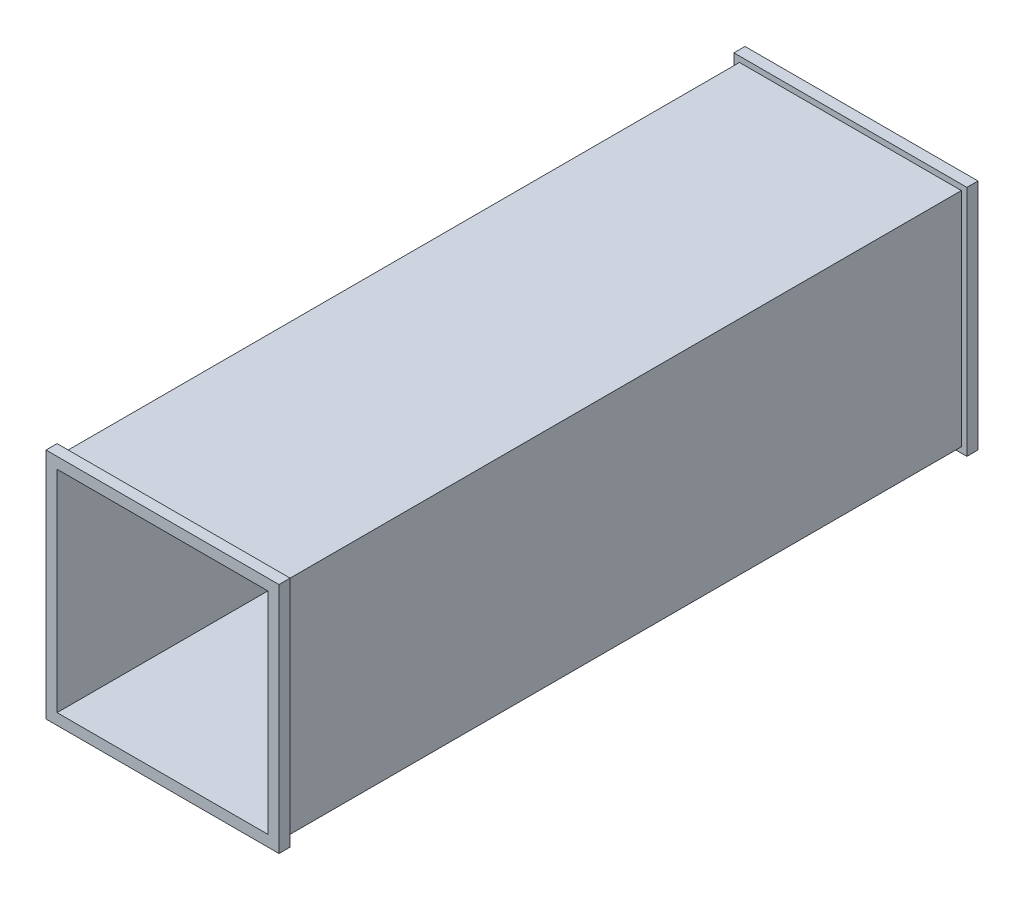
ISO-10303-21;
HEADER;
FILE_DESCRIPTION(('STEP AP214'),'2;1');
FILE_NAME('part.step','',(''),(''),'','','');
FILE_SCHEMA(('AUTOMOTIVE_DESIGN { 1 0 10303 214 1 1 1 1 }'));
ENDSEC;
DATA;
#1=APPLICATION_CONTEXT('core data for automotive mechanical design processes');
#2=APPLICATION_PROTOCOL_DEFINITION('international standard','automotive_design',2000,#1);
#3=PRODUCT_CONTEXT('',#1,'mechanical');
#4=PRODUCT('Part','Part','',(#3));
#5=PRODUCT_RELATED_PRODUCT_CATEGORY('part','',(#4));
#6=PRODUCT_DEFINITION_FORMATION('','',#4);
#7=PRODUCT_DEFINITION_CONTEXT('part definition',#1,'design');
#8=PRODUCT_DEFINITION('design','',#6,#7);
#9=PRODUCT_DEFINITION_SHAPE('','',#8);
#10=(LENGTH_UNIT() NAMED_UNIT(*) SI_UNIT(.MILLI.,.METRE.));
#11=(NAMED_UNIT(*) PLANE_ANGLE_UNIT() SI_UNIT($,.RADIAN.));
#12=(NAMED_UNIT(*) SI_UNIT($,.STERADIAN.) SOLID_ANGLE_UNIT());
#13=UNCERTAINTY_MEASURE_WITH_UNIT(LENGTH_MEASURE(1.E-05),#10,'distance_accuracy_value','');
#14=(GEOMETRIC_REPRESENTATION_CONTEXT(3) GLOBAL_UNCERTAINTY_ASSIGNED_CONTEXT((#13)) GLOBAL_UNIT_ASSIGNED_CONTEXT((#10,
#11,#12)) REPRESENTATION_CONTEXT('',''));
#15=CARTESIAN_POINT('',(0.,0.,0.));
#16=DIRECTION('',(0.,0.,1.));
#17=DIRECTION('',(1.,0.,0.));
#18=AXIS2_PLACEMENT_3D('',#15,#16,#17);
#19=CARTESIAN_POINT('',(254.,0.,0.));
#20=DIRECTION('',(1.,0.,0.));
#21=DIRECTION('',(0.,0.,-1.));
#22=AXIS2_PLACEMENT_3D('',#19,#20,#21);
#23=PLANE('',#22);
#24=DIRECTION('',(0.,0.,-1.));
#25=VECTOR('',#24,1.);
#26=CARTESIAN_POINT('',(254.,-254.,1549.4));
#27=LINE('',#26,#25);
#28=CARTESIAN_POINT('',(254.,-254.,1549.4));
#29=VERTEX_POINT('',#28);
#30=CARTESIAN_POINT('',(254.,-254.,0.));
#31=VERTEX_POINT('',#30);
#32=EDGE_CURVE('E328',#29,#31,#27,.T.);
#33=ORIENTED_EDGE('',*,*,#32,.T.);
#34=DIRECTION('',(0.,1.,0.));
#35=VECTOR('',#34,1.);
#36=CARTESIAN_POINT('',(254.,-254.,0.));
#37=LINE('',#36,#35);
#38=CARTESIAN_POINT('',(254.,254.,0.));
#39=VERTEX_POINT('',#38);
#40=EDGE_CURVE('E337',#31,#39,#37,.T.);
#41=ORIENTED_EDGE('',*,*,#40,.T.);
#42=DIRECTION('',(0.,0.,-1.));
#43=VECTOR('',#42,1.);
#44=CARTESIAN_POINT('',(254.,254.,1549.4));
#45=LINE('',#44,#43);
#46=CARTESIAN_POINT('',(254.,254.,1549.4));
#47=VERTEX_POINT('',#46);
#48=EDGE_CURVE('E325',#47,#39,#45,.T.);
#49=ORIENTED_EDGE('',*,*,#48,.F.);
#50=DIRECTION('',(0.,1.,0.));
#51=VECTOR('',#50,1.);
#52=CARTESIAN_POINT('',(254.,-254.,1549.4));
#53=LINE('',#52,#51);
#54=EDGE_CURVE('E185',#29,#47,#53,.T.);
#55=ORIENTED_EDGE('',*,*,#54,.F.);
#56=EDGE_LOOP('',(#33,#41,#49,#55));
#57=FACE_BOUND('',#56,.T.);
#58=ADVANCED_FACE('F57',(#57),#23,.T.);
#59=CARTESIAN_POINT('',(0.,254.,0.));
#60=DIRECTION('',(0.,1.,0.));
#61=DIRECTION('',(0.,0.,1.));
#62=AXIS2_PLACEMENT_3D('',#59,#60,#61);
#63=PLANE('',#62);
#64=ORIENTED_EDGE('',*,*,#48,.T.);
#65=DIRECTION('',(-1.,0.,0.));
#66=VECTOR('',#65,1.);
#67=CARTESIAN_POINT('',(-254.,254.,0.));
#68=LINE('',#67,#66);
#69=CARTESIAN_POINT('',(-254.,254.,0.));
#70=VERTEX_POINT('',#69);
#71=EDGE_CURVE('E345',#39,#70,#68,.T.);
#72=ORIENTED_EDGE('',*,*,#71,.T.);
#73=DIRECTION('',(0.,0.,-1.));
#74=VECTOR('',#73,1.);
#75=CARTESIAN_POINT('',(-254.,254.,1549.4));
#76=LINE('',#75,#74);
#77=CARTESIAN_POINT('',(-254.,254.,1549.4));
#78=VERTEX_POINT('',#77);
#79=EDGE_CURVE('E324',#78,#70,#76,.T.);
#80=ORIENTED_EDGE('',*,*,#79,.F.);
#81=DIRECTION('',(-1.,0.,0.));
#82=VECTOR('',#81,1.);
#83=CARTESIAN_POINT('',(-254.,254.,1549.4));
#84=LINE('',#83,#82);
#85=EDGE_CURVE('E368',#47,#78,#84,.T.);
#86=ORIENTED_EDGE('',*,*,#85,.F.);
#87=EDGE_LOOP('',(#64,#72,#80,#86));
#88=FACE_BOUND('',#87,.T.);
#89=ADVANCED_FACE('F384',(#88),#63,.T.);
#90=CARTESIAN_POINT('',(0.,-254.,0.));
#91=DIRECTION('',(0.,-1.,0.));
#92=DIRECTION('',(0.,0.,-1.));
#93=AXIS2_PLACEMENT_3D('',#90,#91,#92);
#94=PLANE('',#93);
#95=DIRECTION('',(0.,0.,-1.));
#96=VECTOR('',#95,1.);
#97=CARTESIAN_POINT('',(-254.,-254.,1549.4));
#98=LINE('',#97,#96);
#99=CARTESIAN_POINT('',(-254.,-254.,1549.4));
#100=VERTEX_POINT('',#99);
#101=CARTESIAN_POINT('',(-254.,-254.,0.));
#102=VERTEX_POINT('',#101);
#103=EDGE_CURVE('E320',#100,#102,#98,.T.);
#104=ORIENTED_EDGE('',*,*,#103,.T.);
#105=DIRECTION('',(1.,0.,0.));
#106=VECTOR('',#105,1.);
#107=CARTESIAN_POINT('',(-254.,-254.,0.));
#108=LINE('',#107,#106);
#109=EDGE_CURVE('E12',#102,#31,#108,.T.);
#110=ORIENTED_EDGE('',*,*,#109,.T.);
#111=ORIENTED_EDGE('',*,*,#32,.F.);
#112=DIRECTION('',(1.,0.,0.));
#113=VECTOR('',#112,1.);
#114=CARTESIAN_POINT('',(-254.,-254.,1549.4));
#115=LINE('',#114,#113);
#116=EDGE_CURVE('E332',#100,#29,#115,.T.);
#117=ORIENTED_EDGE('',*,*,#116,.F.);
#118=EDGE_LOOP('',(#104,#110,#111,#117));
#119=FACE_BOUND('',#118,.T.);
#120=ADVANCED_FACE('F386',(#119),#94,.T.);
#121=CARTESIAN_POINT('',(-254.,0.,0.));
#122=DIRECTION('',(-1.,0.,0.));
#123=DIRECTION('',(0.,0.,1.));
#124=AXIS2_PLACEMENT_3D('',#121,#122,#123);
#125=PLANE('',#124);
#126=ORIENTED_EDGE('',*,*,#79,.T.);
#127=DIRECTION('',(0.,-1.,0.));
#128=VECTOR('',#127,1.);
#129=CARTESIAN_POINT('',(-254.,-254.,0.));
#130=LINE('',#129,#128);
#131=EDGE_CURVE('E67',#70,#102,#130,.T.);
#132=ORIENTED_EDGE('',*,*,#131,.T.);
#133=ORIENTED_EDGE('',*,*,#103,.F.);
#134=DIRECTION('',(0.,-1.,0.));
#135=VECTOR('',#134,1.);
#136=CARTESIAN_POINT('',(-254.,-254.,1549.4));
#137=LINE('',#136,#135);
#138=EDGE_CURVE('E82',#78,#100,#137,.T.);
#139=ORIENTED_EDGE('',*,*,#138,.F.);
#140=EDGE_LOOP('',(#126,#132,#133,#139));
#141=FACE_BOUND('',#140,.T.);
#142=ADVANCED_FACE('F59',(#141),#125,.T.);
#143=CARTESIAN_POINT('',(-241.3,0.,0.));
#144=DIRECTION('',(1.,0.,0.));
#145=DIRECTION('',(0.,0.,-1.));
#146=AXIS2_PLACEMENT_3D('',#143,#144,#145);
#147=PLANE('',#146);
#148=DIRECTION('',(0.,0.,1.));
#149=VECTOR('',#148,1.);
#150=CARTESIAN_POINT('',(-241.3,-241.3,0.));
#151=LINE('',#150,#149);
#152=CARTESIAN_POINT('',(-241.3,-241.3,-25.4));
#153=VERTEX_POINT('',#152);
#154=CARTESIAN_POINT('',(-241.3,-241.3,1574.8));
#155=VERTEX_POINT('',#154);
#156=EDGE_CURVE('E304',#153,#155,#151,.T.);
#157=ORIENTED_EDGE('',*,*,#156,.F.);
#158=DIRECTION('',(0.,1.,0.));
#159=VECTOR('',#158,1.);
#160=CARTESIAN_POINT('',(-241.3,-241.3,-25.4));
#161=LINE('',#160,#159);
#162=CARTESIAN_POINT('',(-241.3,241.3,-25.4));
#163=VERTEX_POINT('',#162);
#164=EDGE_CURVE('E249',#153,#163,#161,.T.);
#165=ORIENTED_EDGE('',*,*,#164,.T.);
#166=DIRECTION('',(0.,0.,1.));
#167=VECTOR('',#166,1.);
#168=CARTESIAN_POINT('',(-241.3,241.3,0.));
#169=LINE('',#168,#167);
#170=CARTESIAN_POINT('',(-241.3,241.3,1574.8));
#171=VERTEX_POINT('',#170);
#172=EDGE_CURVE('E307',#163,#171,#169,.T.);
#173=ORIENTED_EDGE('',*,*,#172,.T.);
#174=DIRECTION('',(0.,-1.,0.));
#175=VECTOR('',#174,1.);
#176=CARTESIAN_POINT('',(-241.3,-241.3,1574.8));
#177=LINE('',#176,#175);
#178=EDGE_CURVE('E198',#171,#155,#177,.T.);
#179=ORIENTED_EDGE('',*,*,#178,.T.);
#180=EDGE_LOOP('',(#157,#165,#173,#179));
#181=FACE_BOUND('',#180,.T.);
#182=ADVANCED_FACE('F414',(#181),#147,.T.);
#183=CARTESIAN_POINT('',(0.,241.3,0.));
#184=DIRECTION('',(0.,-1.,0.));
#185=DIRECTION('',(0.,0.,-1.));
#186=AXIS2_PLACEMENT_3D('',#183,#184,#185);
#187=PLANE('',#186);
#188=ORIENTED_EDGE('',*,*,#172,.F.);
#189=DIRECTION('',(1.,0.,0.));
#190=VECTOR('',#189,1.);
#191=CARTESIAN_POINT('',(241.3,241.3,-25.4));
#192=LINE('',#191,#190);
#193=CARTESIAN_POINT('',(241.3,241.3,-25.4));
#194=VERTEX_POINT('',#193);
#195=EDGE_CURVE('E180',#163,#194,#192,.T.);
#196=ORIENTED_EDGE('',*,*,#195,.T.);
#197=DIRECTION('',(0.,0.,1.));
#198=VECTOR('',#197,1.);
#199=CARTESIAN_POINT('',(241.3,241.3,0.));
#200=LINE('',#199,#198);
#201=CARTESIAN_POINT('',(241.3,241.3,1574.8));
#202=VERTEX_POINT('',#201);
#203=EDGE_CURVE('E173',#194,#202,#200,.T.);
#204=ORIENTED_EDGE('',*,*,#203,.T.);
#205=DIRECTION('',(-1.,0.,0.));
#206=VECTOR('',#205,1.);
#207=CARTESIAN_POINT('',(-241.3,241.3,1574.8));
#208=LINE('',#207,#206);
#209=EDGE_CURVE('E177',#202,#171,#208,.T.);
#210=ORIENTED_EDGE('',*,*,#209,.T.);
#211=EDGE_LOOP('',(#188,#196,#204,#210));
#212=FACE_BOUND('',#211,.T.);
#213=ADVANCED_FACE('F175',(#212),#187,.T.);
#214=CARTESIAN_POINT('',(0.,-241.3,0.));
#215=DIRECTION('',(0.,1.,0.));
#216=DIRECTION('',(0.,0.,1.));
#217=AXIS2_PLACEMENT_3D('',#214,#215,#216);
#218=PLANE('',#217);
#219=DIRECTION('',(0.,0.,1.));
#220=VECTOR('',#219,1.);
#221=CARTESIAN_POINT('',(241.3,-241.3,0.));
#222=LINE('',#221,#220);
#223=CARTESIAN_POINT('',(241.3,-241.3,-25.4));
#224=VERTEX_POINT('',#223);
#225=CARTESIAN_POINT('',(241.3,-241.3,1574.8));
#226=VERTEX_POINT('',#225);
#227=EDGE_CURVE('E186',#224,#226,#222,.T.);
#228=ORIENTED_EDGE('',*,*,#227,.F.);
#229=DIRECTION('',(-1.,0.,0.));
#230=VECTOR('',#229,1.);
#231=CARTESIAN_POINT('',(241.3,-241.3,-25.4));
#232=LINE('',#231,#230);
#233=EDGE_CURVE('E258',#224,#153,#232,.T.);
#234=ORIENTED_EDGE('',*,*,#233,.T.);
#235=ORIENTED_EDGE('',*,*,#156,.T.);
#236=DIRECTION('',(1.,0.,0.));
#237=VECTOR('',#236,1.);
#238=CARTESIAN_POINT('',(-241.3,-241.3,1574.8));
#239=LINE('',#238,#237);
#240=EDGE_CURVE('E202',#155,#226,#239,.T.);
#241=ORIENTED_EDGE('',*,*,#240,.T.);
#242=EDGE_LOOP('',(#228,#234,#235,#241));
#243=FACE_BOUND('',#242,.T.);
#244=ADVANCED_FACE('F399',(#243),#218,.T.);
#245=CARTESIAN_POINT('',(241.3,0.,0.));
#246=DIRECTION('',(-1.,0.,0.));
#247=DIRECTION('',(0.,0.,1.));
#248=AXIS2_PLACEMENT_3D('',#245,#246,#247);
#249=PLANE('',#248);
#250=ORIENTED_EDGE('',*,*,#203,.F.);
#251=DIRECTION('',(0.,-1.,0.));
#252=VECTOR('',#251,1.);
#253=CARTESIAN_POINT('',(241.3,-241.3,-25.4));
#254=LINE('',#253,#252);
#255=EDGE_CURVE('E255',#194,#224,#254,.T.);
#256=ORIENTED_EDGE('',*,*,#255,.T.);
#257=ORIENTED_EDGE('',*,*,#227,.T.);
#258=DIRECTION('',(0.,1.,0.));
#259=VECTOR('',#258,1.);
#260=CARTESIAN_POINT('',(241.3,-241.3,1574.8));
#261=LINE('',#260,#259);
#262=EDGE_CURVE('E189',#226,#202,#261,.T.);
#263=ORIENTED_EDGE('',*,*,#262,.T.);
#264=EDGE_LOOP('',(#250,#256,#257,#263));
#265=FACE_BOUND('',#264,.T.);
#266=ADVANCED_FACE('F190',(#265),#249,.T.);
#267=CARTESIAN_POINT('',(0.,0.,0.));
#268=DIRECTION('',(0.,0.,-1.));
#269=DIRECTION('',(-1.,0.,0.));
#270=AXIS2_PLACEMENT_3D('',#267,#268,#269);
#271=PLANE('',#270);
#272=DIRECTION('',(-1.,0.,0.));
#273=VECTOR('',#272,1.);
#274=CARTESIAN_POINT('',(266.7,-266.7,0.));
#275=LINE('',#274,#273);
#276=CARTESIAN_POINT('',(266.7,-266.7,0.));
#277=VERTEX_POINT('',#276);
#278=CARTESIAN_POINT('',(-266.7,-266.7,0.));
#279=VERTEX_POINT('',#278);
#280=EDGE_CURVE('E262',#277,#279,#275,.T.);
#281=ORIENTED_EDGE('',*,*,#280,.F.);
#282=DIRECTION('',(0.,-1.,0.));
#283=VECTOR('',#282,1.);
#284=CARTESIAN_POINT('',(266.7,266.7,0.));
#285=LINE('',#284,#283);
#286=CARTESIAN_POINT('',(266.7,266.7,0.));
#287=VERTEX_POINT('',#286);
#288=EDGE_CURVE('E268',#287,#277,#285,.T.);
#289=ORIENTED_EDGE('',*,*,#288,.F.);
#290=DIRECTION('',(1.,0.,0.));
#291=VECTOR('',#290,1.);
#292=CARTESIAN_POINT('',(-266.7,266.7,0.));
#293=LINE('',#292,#291);
#294=CARTESIAN_POINT('',(-266.7,266.7,0.));
#295=VERTEX_POINT('',#294);
#296=EDGE_CURVE('E284',#295,#287,#293,.T.);
#297=ORIENTED_EDGE('',*,*,#296,.F.);
#298=DIRECTION('',(0.,1.,0.));
#299=VECTOR('',#298,1.);
#300=CARTESIAN_POINT('',(-266.7,-266.7,0.));
#301=LINE('',#300,#299);
#302=EDGE_CURVE('E281',#279,#295,#301,.T.);
#303=ORIENTED_EDGE('',*,*,#302,.F.);
#304=EDGE_LOOP('',(#281,#289,#297,#303));
#305=FACE_BOUND('',#304,.T.);
#306=ORIENTED_EDGE('',*,*,#71,.F.);
#307=ORIENTED_EDGE('',*,*,#40,.F.);
#308=ORIENTED_EDGE('',*,*,#109,.F.);
#309=ORIENTED_EDGE('',*,*,#131,.F.);
#310=EDGE_LOOP('',(#306,#307,#308,#309));
#311=FACE_BOUND('',#310,.T.);
#312=ADVANCED_FACE('F387',(#305,#311),#271,.F.);
#313=CARTESIAN_POINT('',(0.,0.,-25.4));
#314=DIRECTION('',(0.,0.,-1.));
#315=DIRECTION('',(-1.,0.,0.));
#316=AXIS2_PLACEMENT_3D('',#313,#314,#315);
#317=PLANE('',#316);
#318=DIRECTION('',(-1.,0.,0.));
#319=VECTOR('',#318,1.);
#320=CARTESIAN_POINT('',(266.7,-266.7,-25.4));
#321=LINE('',#320,#319);
#322=CARTESIAN_POINT('',(266.7,-266.7,-25.4));
#323=VERTEX_POINT('',#322);
#324=CARTESIAN_POINT('',(-266.7,-266.7,-25.4));
#325=VERTEX_POINT('',#324);
#326=EDGE_CURVE('E263',#323,#325,#321,.T.);
#327=ORIENTED_EDGE('',*,*,#326,.T.);
#328=DIRECTION('',(0.,1.,0.));
#329=VECTOR('',#328,1.);
#330=CARTESIAN_POINT('',(-266.7,-266.7,-25.4));
#331=LINE('',#330,#329);
#332=CARTESIAN_POINT('',(-266.7,266.7,-25.4));
#333=VERTEX_POINT('',#332);
#334=EDGE_CURVE('E267',#325,#333,#331,.T.);
#335=ORIENTED_EDGE('',*,*,#334,.T.);
#336=DIRECTION('',(1.,0.,0.));
#337=VECTOR('',#336,1.);
#338=CARTESIAN_POINT('',(-266.7,266.7,-25.4));
#339=LINE('',#338,#337);
#340=CARTESIAN_POINT('',(266.7,266.7,-25.4));
#341=VERTEX_POINT('',#340);
#342=EDGE_CURVE('E271',#333,#341,#339,.T.);
#343=ORIENTED_EDGE('',*,*,#342,.T.);
#344=DIRECTION('',(0.,-1.,0.));
#345=VECTOR('',#344,1.);
#346=CARTESIAN_POINT('',(266.7,266.7,-25.4));
#347=LINE('',#346,#345);
#348=EDGE_CURVE('E274',#341,#323,#347,.T.);
#349=ORIENTED_EDGE('',*,*,#348,.T.);
#350=EDGE_LOOP('',(#327,#335,#343,#349));
#351=FACE_BOUND('',#350,.T.);
#352=ORIENTED_EDGE('',*,*,#195,.F.);
#353=ORIENTED_EDGE('',*,*,#164,.F.);
#354=ORIENTED_EDGE('',*,*,#233,.F.);
#355=ORIENTED_EDGE('',*,*,#255,.F.);
#356=EDGE_LOOP('',(#352,#353,#354,#355));
#357=FACE_BOUND('',#356,.T.);
#358=ADVANCED_FACE('F389',(#351,#357),#317,.T.);
#359=CARTESIAN_POINT('',(266.7,-266.7,-25.4));
#360=DIRECTION('',(0.,1.,0.));
#361=DIRECTION('',(0.,0.,1.));
#362=AXIS2_PLACEMENT_3D('',#359,#360,#361);
#363=PLANE('',#362);
#364=ORIENTED_EDGE('',*,*,#280,.T.);
#365=DIRECTION('',(0.,0.,1.));
#366=VECTOR('',#365,1.);
#367=CARTESIAN_POINT('',(-266.7,-266.7,-25.4));
#368=LINE('',#367,#366);
#369=EDGE_CURVE('E300',#325,#279,#368,.T.);
#370=ORIENTED_EDGE('',*,*,#369,.F.);
#371=ORIENTED_EDGE('',*,*,#326,.F.);
#372=DIRECTION('',(0.,0.,1.));
#373=VECTOR('',#372,1.);
#374=CARTESIAN_POINT('',(266.7,-266.7,-25.4));
#375=LINE('',#374,#373);
#376=EDGE_CURVE('E277',#323,#277,#375,.T.);
#377=ORIENTED_EDGE('',*,*,#376,.T.);
#378=EDGE_LOOP('',(#364,#370,#371,#377));
#379=FACE_BOUND('',#378,.T.);
#380=ADVANCED_FACE('F396',(#379),#363,.F.);
#381=CARTESIAN_POINT('',(-266.7,-266.7,-25.4));
#382=DIRECTION('',(1.,0.,0.));
#383=DIRECTION('',(0.,0.,-1.));
#384=AXIS2_PLACEMENT_3D('',#381,#382,#383);
#385=PLANE('',#384);
#386=ORIENTED_EDGE('',*,*,#302,.T.);
#387=DIRECTION('',(0.,0.,1.));
#388=VECTOR('',#387,1.);
#389=CARTESIAN_POINT('',(-266.7,266.7,-25.4));
#390=LINE('',#389,#388);
#391=EDGE_CURVE('E296',#333,#295,#390,.T.);
#392=ORIENTED_EDGE('',*,*,#391,.F.);
#393=ORIENTED_EDGE('',*,*,#334,.F.);
#394=ORIENTED_EDGE('',*,*,#369,.T.);
#395=EDGE_LOOP('',(#386,#392,#393,#394));
#396=FACE_BOUND('',#395,.T.);
#397=ADVANCED_FACE('F524',(#396),#385,.F.);
#398=CARTESIAN_POINT('',(-266.7,266.7,-25.4));
#399=DIRECTION('',(0.,-1.,0.));
#400=DIRECTION('',(0.,0.,-1.));
#401=AXIS2_PLACEMENT_3D('',#398,#399,#400);
#402=PLANE('',#401);
#403=ORIENTED_EDGE('',*,*,#296,.T.);
#404=DIRECTION('',(0.,0.,1.));
#405=VECTOR('',#404,1.);
#406=CARTESIAN_POINT('',(266.7,266.7,-25.4));
#407=LINE('',#406,#405);
#408=EDGE_CURVE('E292',#341,#287,#407,.T.);
#409=ORIENTED_EDGE('',*,*,#408,.F.);
#410=ORIENTED_EDGE('',*,*,#342,.F.);
#411=ORIENTED_EDGE('',*,*,#391,.T.);
#412=EDGE_LOOP('',(#403,#409,#410,#411));
#413=FACE_BOUND('',#412,.T.);
#414=ADVANCED_FACE('F517',(#413),#402,.F.);
#415=CARTESIAN_POINT('',(266.7,266.7,-25.4));
#416=DIRECTION('',(-1.,0.,0.));
#417=DIRECTION('',(0.,0.,1.));
#418=AXIS2_PLACEMENT_3D('',#415,#416,#417);
#419=PLANE('',#418);
#420=ORIENTED_EDGE('',*,*,#288,.T.);
#421=ORIENTED_EDGE('',*,*,#376,.F.);
#422=ORIENTED_EDGE('',*,*,#348,.F.);
#423=ORIENTED_EDGE('',*,*,#408,.T.);
#424=EDGE_LOOP('',(#420,#421,#422,#423));
#425=FACE_BOUND('',#424,.T.);
#426=ADVANCED_FACE('F449',(#425),#419,.F.);
#427=CARTESIAN_POINT('',(0.,0.,1549.4));
#428=DIRECTION('',(0.,0.,1.));
#429=DIRECTION('',(1.,0.,0.));
#430=AXIS2_PLACEMENT_3D('',#427,#428,#429);
#431=PLANE('',#430);
#432=DIRECTION('',(1.,0.,0.));
#433=VECTOR('',#432,1.);
#434=CARTESIAN_POINT('',(-266.7,-266.7,1549.4));
#435=LINE('',#434,#433);
#436=CARTESIAN_POINT('',(-266.7,-266.7,1549.4));
#437=VERTEX_POINT('',#436);
#438=CARTESIAN_POINT('',(266.7,-266.7,1549.4));
#439=VERTEX_POINT('',#438);
#440=EDGE_CURVE('E207',#437,#439,#435,.T.);
#441=ORIENTED_EDGE('',*,*,#440,.F.);
#442=DIRECTION('',(0.,-1.,0.));
#443=VECTOR('',#442,1.);
#444=CARTESIAN_POINT('',(-266.7,266.7,1549.4));
#445=LINE('',#444,#443);
#446=CARTESIAN_POINT('',(-266.7,266.7,1549.4));
#447=VERTEX_POINT('',#446);
#448=EDGE_CURVE('E213',#447,#437,#445,.T.);
#449=ORIENTED_EDGE('',*,*,#448,.F.);
#450=DIRECTION('',(-1.,0.,0.));
#451=VECTOR('',#450,1.);
#452=CARTESIAN_POINT('',(266.7,266.7,1549.4));
#453=LINE('',#452,#451);
#454=CARTESIAN_POINT('',(266.7,266.7,1549.4));
#455=VERTEX_POINT('',#454);
#456=EDGE_CURVE('E229',#455,#447,#453,.T.);
#457=ORIENTED_EDGE('',*,*,#456,.F.);
#458=DIRECTION('',(0.,1.,0.));
#459=VECTOR('',#458,1.);
#460=CARTESIAN_POINT('',(266.7,-266.7,1549.4));
#461=LINE('',#460,#459);
#462=EDGE_CURVE('E226',#439,#455,#461,.T.);
#463=ORIENTED_EDGE('',*,*,#462,.F.);
#464=EDGE_LOOP('',(#441,#449,#457,#463));
#465=FACE_BOUND('',#464,.T.);
#466=ORIENTED_EDGE('',*,*,#116,.T.);
#467=ORIENTED_EDGE('',*,*,#54,.T.);
#468=ORIENTED_EDGE('',*,*,#85,.T.);
#469=ORIENTED_EDGE('',*,*,#138,.T.);
#470=EDGE_LOOP('',(#466,#467,#468,#469));
#471=FACE_BOUND('',#470,.T.);
#472=ADVANCED_FACE('F379',(#465,#471),#431,.F.);
#473=CARTESIAN_POINT('',(0.,0.,1574.8));
#474=DIRECTION('',(0.,0.,1.));
#475=DIRECTION('',(1.,0.,0.));
#476=AXIS2_PLACEMENT_3D('',#473,#474,#475);
#477=PLANE('',#476);
#478=DIRECTION('',(1.,0.,0.));
#479=VECTOR('',#478,1.);
#480=CARTESIAN_POINT('',(-266.7,-266.7,1574.8));
#481=LINE('',#480,#479);
#482=CARTESIAN_POINT('',(-266.7,-266.7,1574.8));
#483=VERTEX_POINT('',#482);
#484=CARTESIAN_POINT('',(266.7,-266.7,1574.8));
#485=VERTEX_POINT('',#484);
#486=EDGE_CURVE('E208',#483,#485,#481,.T.);
#487=ORIENTED_EDGE('',*,*,#486,.T.);
#488=DIRECTION('',(0.,1.,0.));
#489=VECTOR('',#488,1.);
#490=CARTESIAN_POINT('',(266.7,-266.7,1574.8));
#491=LINE('',#490,#489);
#492=CARTESIAN_POINT('',(266.7,266.7,1574.8));
#493=VERTEX_POINT('',#492);
#494=EDGE_CURVE('E212',#485,#493,#491,.T.);
#495=ORIENTED_EDGE('',*,*,#494,.T.);
#496=DIRECTION('',(-1.,0.,0.));
#497=VECTOR('',#496,1.);
#498=CARTESIAN_POINT('',(266.7,266.7,1574.8));
#499=LINE('',#498,#497);
#500=CARTESIAN_POINT('',(-266.7,266.7,1574.8));
#501=VERTEX_POINT('',#500);
#502=EDGE_CURVE('E216',#493,#501,#499,.T.);
#503=ORIENTED_EDGE('',*,*,#502,.T.);
#504=DIRECTION('',(0.,-1.,0.));
#505=VECTOR('',#504,1.);
#506=CARTESIAN_POINT('',(-266.7,266.7,1574.8));
#507=LINE('',#506,#505);
#508=EDGE_CURVE('E219',#501,#483,#507,.T.);
#509=ORIENTED_EDGE('',*,*,#508,.T.);
#510=EDGE_LOOP('',(#487,#495,#503,#509));
#511=FACE_BOUND('',#510,.T.);
#512=ORIENTED_EDGE('',*,*,#209,.F.);
#513=ORIENTED_EDGE('',*,*,#262,.F.);
#514=ORIENTED_EDGE('',*,*,#240,.F.);
#515=ORIENTED_EDGE('',*,*,#178,.F.);
#516=EDGE_LOOP('',(#512,#513,#514,#515));
#517=FACE_BOUND('',#516,.T.);
#518=ADVANCED_FACE('F196',(#511,#517),#477,.T.);
#519=CARTESIAN_POINT('',(-266.7,-266.7,1574.8));
#520=DIRECTION('',(0.,1.,0.));
#521=DIRECTION('',(0.,0.,1.));
#522=AXIS2_PLACEMENT_3D('',#519,#520,#521);
#523=PLANE('',#522);
#524=ORIENTED_EDGE('',*,*,#440,.T.);
#525=DIRECTION('',(0.,0.,-1.));
#526=VECTOR('',#525,1.);
#527=CARTESIAN_POINT('',(266.7,-266.7,1574.8));
#528=LINE('',#527,#526);
#529=EDGE_CURVE('E245',#485,#439,#528,.T.);
#530=ORIENTED_EDGE('',*,*,#529,.F.);
#531=ORIENTED_EDGE('',*,*,#486,.F.);
#532=DIRECTION('',(0.,0.,-1.));
#533=VECTOR('',#532,1.);
#534=CARTESIAN_POINT('',(-266.7,-266.7,1574.8));
#535=LINE('',#534,#533);
#536=EDGE_CURVE('E222',#483,#437,#535,.T.);
#537=ORIENTED_EDGE('',*,*,#536,.T.);
#538=EDGE_LOOP('',(#524,#530,#531,#537));
#539=FACE_BOUND('',#538,.T.);
#540=ADVANCED_FACE('F460',(#539),#523,.F.);
#541=CARTESIAN_POINT('',(266.7,-266.7,1574.8));
#542=DIRECTION('',(-1.,0.,0.));
#543=DIRECTION('',(0.,0.,1.));
#544=AXIS2_PLACEMENT_3D('',#541,#542,#543);
#545=PLANE('',#544);
#546=ORIENTED_EDGE('',*,*,#462,.T.);
#547=DIRECTION('',(0.,0.,-1.));
#548=VECTOR('',#547,1.);
#549=CARTESIAN_POINT('',(266.7,266.7,1574.8));
#550=LINE('',#549,#548);
#551=EDGE_CURVE('E241',#493,#455,#550,.T.);
#552=ORIENTED_EDGE('',*,*,#551,.F.);
#553=ORIENTED_EDGE('',*,*,#494,.F.);
#554=ORIENTED_EDGE('',*,*,#529,.T.);
#555=EDGE_LOOP('',(#546,#552,#553,#554));
#556=FACE_BOUND('',#555,.T.);
#557=ADVANCED_FACE('F470',(#556),#545,.F.);
#558=CARTESIAN_POINT('',(266.7,266.7,1574.8));
#559=DIRECTION('',(0.,-1.,0.));
#560=DIRECTION('',(0.,0.,-1.));
#561=AXIS2_PLACEMENT_3D('',#558,#559,#560);
#562=PLANE('',#561);
#563=ORIENTED_EDGE('',*,*,#456,.T.);
#564=DIRECTION('',(0.,0.,-1.));
#565=VECTOR('',#564,1.);
#566=CARTESIAN_POINT('',(-266.7,266.7,1574.8));
#567=LINE('',#566,#565);
#568=EDGE_CURVE('E237',#501,#447,#567,.T.);
#569=ORIENTED_EDGE('',*,*,#568,.F.);
#570=ORIENTED_EDGE('',*,*,#502,.F.);
#571=ORIENTED_EDGE('',*,*,#551,.T.);
#572=EDGE_LOOP('',(#563,#569,#570,#571));
#573=FACE_BOUND('',#572,.T.);
#574=ADVANCED_FACE('F480',(#573),#562,.F.);
#575=CARTESIAN_POINT('',(-266.7,266.7,1574.8));
#576=DIRECTION('',(1.,0.,0.));
#577=DIRECTION('',(0.,0.,-1.));
#578=AXIS2_PLACEMENT_3D('',#575,#576,#577);
#579=PLANE('',#578);
#580=ORIENTED_EDGE('',*,*,#448,.T.);
#581=ORIENTED_EDGE('',*,*,#536,.F.);
#582=ORIENTED_EDGE('',*,*,#508,.F.);
#583=ORIENTED_EDGE('',*,*,#568,.T.);
#584=EDGE_LOOP('',(#580,#581,#582,#583));
#585=FACE_BOUND('',#584,.T.);
#586=ADVANCED_FACE('F490',(#585),#579,.F.);
#587=CLOSED_SHELL('',(#58,#89,#120,#142,#182,#213,#244,#266,#312,#358,#380,#397,#414,#426,#472,
#518,#540,#557,#574,#586));
#588=MANIFOLD_SOLID_BREP('B2',#587);
#589=ADVANCED_BREP_SHAPE_REPRESENTATION('',(#18,#588),#14);
#590=SHAPE_DEFINITION_REPRESENTATION(#9,#589);
ENDSEC;
END-ISO-10303-21;
